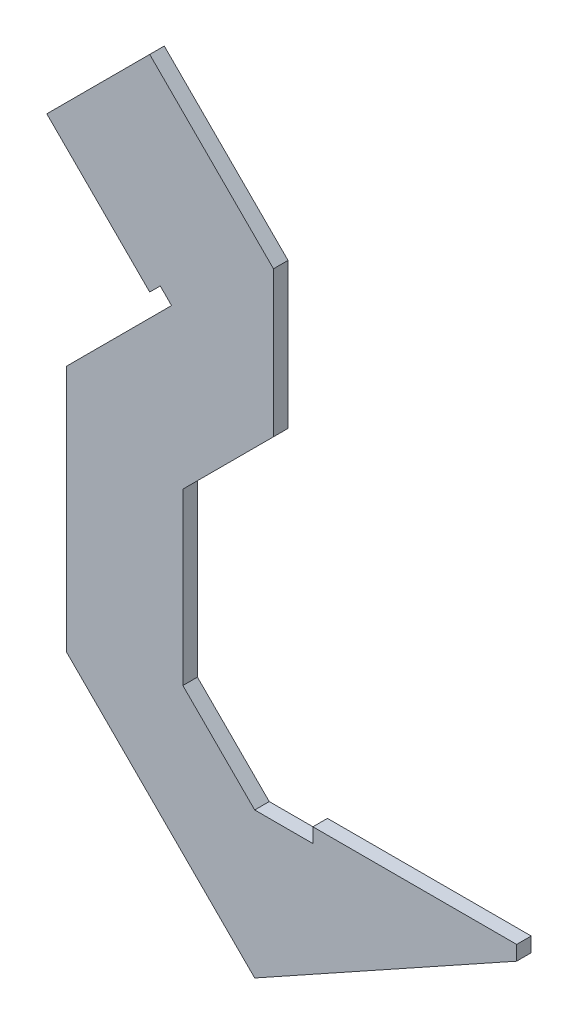
ISO-10303-21;
HEADER;
FILE_DESCRIPTION(('STEP AP214'),'2;1');
FILE_NAME('part.step','',(''),(''),'','','');
FILE_SCHEMA(('AUTOMOTIVE_DESIGN { 1 0 10303 214 1 1 1 1 }'));
ENDSEC;
DATA;
#1=APPLICATION_CONTEXT('core data for automotive mechanical design processes');
#2=APPLICATION_PROTOCOL_DEFINITION('international standard','automotive_design',2000,#1);
#3=PRODUCT_CONTEXT('',#1,'mechanical');
#4=PRODUCT('Part','Part','',(#3));
#5=PRODUCT_RELATED_PRODUCT_CATEGORY('part','',(#4));
#6=PRODUCT_DEFINITION_FORMATION('','',#4);
#7=PRODUCT_DEFINITION_CONTEXT('part definition',#1,'design');
#8=PRODUCT_DEFINITION('design','',#6,#7);
#9=PRODUCT_DEFINITION_SHAPE('','',#8);
#10=(LENGTH_UNIT() NAMED_UNIT(*) SI_UNIT(.MILLI.,.METRE.));
#11=(NAMED_UNIT(*) PLANE_ANGLE_UNIT() SI_UNIT($,.RADIAN.));
#12=(NAMED_UNIT(*) SI_UNIT($,.STERADIAN.) SOLID_ANGLE_UNIT());
#13=UNCERTAINTY_MEASURE_WITH_UNIT(LENGTH_MEASURE(1.E-05),#10,'distance_accuracy_value','');
#14=(GEOMETRIC_REPRESENTATION_CONTEXT(3) GLOBAL_UNCERTAINTY_ASSIGNED_CONTEXT((#13)) GLOBAL_UNIT_ASSIGNED_CONTEXT((#10,
#11,#12)) REPRESENTATION_CONTEXT('',''));
#15=CARTESIAN_POINT('',(0.,0.,0.));
#16=DIRECTION('',(0.,0.,1.));
#17=DIRECTION('',(1.,0.,0.));
#18=AXIS2_PLACEMENT_3D('',#15,#16,#17);
#19=CARTESIAN_POINT('',(-3.09372562444041,1.89384139237618,0.05));
#20=DIRECTION('',(1.,0.,0.));
#21=DIRECTION('',(0.,0.,-1.));
#22=AXIS2_PLACEMENT_3D('',#19,#20,#21);
#23=PLANE('',#22);
#24=DIRECTION('',(0.,-1.,0.));
#25=VECTOR('',#24,1.);
#26=CARTESIAN_POINT('',(-3.09372562444041,1.89384139237618,-0.05));
#27=LINE('',#26,#25);
#28=CARTESIAN_POINT('',(-3.09372562444041,1.89384139237618,-0.05));
#29=VERTEX_POINT('',#28);
#30=CARTESIAN_POINT('',(-3.09372562444041,0.193725624440412,-0.05));
#31=VERTEX_POINT('',#30);
#32=EDGE_CURVE('E194',#29,#31,#27,.T.);
#33=ORIENTED_EDGE('',*,*,#32,.T.);
#34=DIRECTION('',(0.,0.,-1.));
#35=VECTOR('',#34,1.);
#36=CARTESIAN_POINT('',(-3.09372562444041,0.193725624440412,0.05));
#37=LINE('',#36,#35);
#38=CARTESIAN_POINT('',(-3.09372562444041,0.193725624440412,0.05));
#39=VERTEX_POINT('',#38);
#40=EDGE_CURVE('E11',#39,#31,#37,.T.);
#41=ORIENTED_EDGE('',*,*,#40,.F.);
#42=DIRECTION('',(0.,-1.,0.));
#43=VECTOR('',#42,1.);
#44=CARTESIAN_POINT('',(-3.09372562444041,1.89384139237618,0.05));
#45=LINE('',#44,#43);
#46=CARTESIAN_POINT('',(-3.09372562444041,1.89384139237618,0.05));
#47=VERTEX_POINT('',#46);
#48=EDGE_CURVE('E243',#47,#39,#45,.T.);
#49=ORIENTED_EDGE('',*,*,#48,.F.);
#50=DIRECTION('',(0.,0.,-1.));
#51=VECTOR('',#50,1.);
#52=CARTESIAN_POINT('',(-3.09372562444041,1.89384139237618,0.05));
#53=LINE('',#52,#51);
#54=EDGE_CURVE('E190',#47,#29,#53,.T.);
#55=ORIENTED_EDGE('',*,*,#54,.T.);
#56=EDGE_LOOP('',(#33,#41,#49,#55));
#57=FACE_BOUND('',#56,.T.);
#58=ADVANCED_FACE('F39',(#57),#23,.F.);
#59=CARTESIAN_POINT('',(-3.09372562444041,0.193725624440412,0.05));
#60=DIRECTION('',(0.707106781186547,0.707106781186548,0.));
#61=DIRECTION('',(-0.707106781186548,0.707106781186547,0.));
#62=AXIS2_PLACEMENT_3D('',#59,#60,#61);
#63=PLANE('',#62);
#64=DIRECTION('',(0.707106781186548,-0.707106781186547,0.));
#65=VECTOR('',#64,1.);
#66=CARTESIAN_POINT('',(-3.09372562444041,0.193725624440412,-0.05));
#67=LINE('',#66,#65);
#68=CARTESIAN_POINT('',(-1.8,-1.1,-0.05));
#69=VERTEX_POINT('',#68);
#70=EDGE_CURVE('E198',#31,#69,#67,.T.);
#71=ORIENTED_EDGE('',*,*,#70,.T.);
#72=DIRECTION('',(0.,0.,-1.));
#73=VECTOR('',#72,1.);
#74=CARTESIAN_POINT('',(-1.8,-1.1,0.05));
#75=LINE('',#74,#73);
#76=CARTESIAN_POINT('',(-1.8,-1.1,0.05));
#77=VERTEX_POINT('',#76);
#78=EDGE_CURVE('E48',#77,#69,#75,.T.);
#79=ORIENTED_EDGE('',*,*,#78,.F.);
#80=DIRECTION('',(0.707106781186548,-0.707106781186547,0.));
#81=VECTOR('',#80,1.);
#82=CARTESIAN_POINT('',(-3.09372562444041,0.193725624440412,0.05));
#83=LINE('',#82,#81);
#84=EDGE_CURVE('E126',#39,#77,#83,.T.);
#85=ORIENTED_EDGE('',*,*,#84,.F.);
#86=ORIENTED_EDGE('',*,*,#40,.T.);
#87=EDGE_LOOP('',(#71,#79,#85,#86));
#88=FACE_BOUND('',#87,.T.);
#89=ADVANCED_FACE('F372',(#88),#63,.F.);
#90=CARTESIAN_POINT('',(-1.8,-1.1,0.05));
#91=DIRECTION('',(-0.485642931178632,0.874157276121538,0.));
#92=DIRECTION('',(-0.874157276121538,-0.485642931178632,0.));
#93=AXIS2_PLACEMENT_3D('',#90,#91,#92);
#94=PLANE('',#93);
#95=DIRECTION('',(0.874157276121538,0.485642931178632,0.));
#96=VECTOR('',#95,1.);
#97=CARTESIAN_POINT('',(-1.8,-1.1,-0.05));
#98=LINE('',#97,#96);
#99=CARTESIAN_POINT('',(0.,-0.1,-0.05));
#100=VERTEX_POINT('',#99);
#101=EDGE_CURVE('E201',#69,#100,#98,.T.);
#102=ORIENTED_EDGE('',*,*,#101,.T.);
#103=DIRECTION('',(0.,0.,-1.));
#104=VECTOR('',#103,1.);
#105=CARTESIAN_POINT('',(0.,-0.1,0.05));
#106=LINE('',#105,#104);
#107=CARTESIAN_POINT('',(0.,-0.1,0.05));
#108=VERTEX_POINT('',#107);
#109=EDGE_CURVE('E290',#108,#100,#106,.T.);
#110=ORIENTED_EDGE('',*,*,#109,.F.);
#111=DIRECTION('',(0.874157276121538,0.485642931178632,0.));
#112=VECTOR('',#111,1.);
#113=CARTESIAN_POINT('',(-1.8,-1.1,0.05));
#114=LINE('',#113,#112);
#115=EDGE_CURVE('E300',#77,#108,#114,.T.);
#116=ORIENTED_EDGE('',*,*,#115,.F.);
#117=ORIENTED_EDGE('',*,*,#78,.T.);
#118=EDGE_LOOP('',(#102,#110,#116,#117));
#119=FACE_BOUND('',#118,.T.);
#120=ADVANCED_FACE('F298',(#119),#94,.F.);
#121=CARTESIAN_POINT('',(0.,-0.1,0.05));
#122=DIRECTION('',(-1.,0.,0.));
#123=DIRECTION('',(0.,0.,1.));
#124=AXIS2_PLACEMENT_3D('',#121,#122,#123);
#125=PLANE('',#124);
#126=DIRECTION('',(0.,1.,0.));
#127=VECTOR('',#126,1.);
#128=CARTESIAN_POINT('',(0.,-0.1,-0.05));
#129=LINE('',#128,#127);
#130=CARTESIAN_POINT('',(0.,0.,-0.05));
#131=VERTEX_POINT('',#130);
#132=EDGE_CURVE('E204',#100,#131,#129,.T.);
#133=ORIENTED_EDGE('',*,*,#132,.T.);
#134=DIRECTION('',(0.,0.,-1.));
#135=VECTOR('',#134,1.);
#136=CARTESIAN_POINT('',(0.,0.,0.05));
#137=LINE('',#136,#135);
#138=CARTESIAN_POINT('',(0.,0.,0.05));
#139=VERTEX_POINT('',#138);
#140=EDGE_CURVE('E286',#139,#131,#137,.T.);
#141=ORIENTED_EDGE('',*,*,#140,.F.);
#142=DIRECTION('',(0.,1.,0.));
#143=VECTOR('',#142,1.);
#144=CARTESIAN_POINT('',(0.,-0.1,0.05));
#145=LINE('',#144,#143);
#146=EDGE_CURVE('E319',#108,#139,#145,.T.);
#147=ORIENTED_EDGE('',*,*,#146,.F.);
#148=ORIENTED_EDGE('',*,*,#109,.T.);
#149=EDGE_LOOP('',(#133,#141,#147,#148));
#150=FACE_BOUND('',#149,.T.);
#151=ADVANCED_FACE('F309',(#150),#125,.F.);
#152=CARTESIAN_POINT('',(0.,0.,0.05));
#153=DIRECTION('',(0.,-1.,0.));
#154=DIRECTION('',(1.,0.,0.));
#155=AXIS2_PLACEMENT_3D('',#152,#153,#154);
#156=PLANE('',#155);
#157=DIRECTION('',(-1.,0.,0.));
#158=VECTOR('',#157,1.);
#159=CARTESIAN_POINT('',(0.,0.,-0.05));
#160=LINE('',#159,#158);
#161=CARTESIAN_POINT('',(-1.4,0.,-0.05));
#162=VERTEX_POINT('',#161);
#163=EDGE_CURVE('E207',#131,#162,#160,.T.);
#164=ORIENTED_EDGE('',*,*,#163,.T.);
#165=DIRECTION('',(0.,0.,-1.));
#166=VECTOR('',#165,1.);
#167=CARTESIAN_POINT('',(-1.4,0.,0.05));
#168=LINE('',#167,#166);
#169=CARTESIAN_POINT('',(-1.4,0.,0.05));
#170=VERTEX_POINT('',#169);
#171=EDGE_CURVE('E282',#170,#162,#168,.T.);
#172=ORIENTED_EDGE('',*,*,#171,.F.);
#173=DIRECTION('',(-1.,0.,0.));
#174=VECTOR('',#173,1.);
#175=CARTESIAN_POINT('',(0.,0.,0.05));
#176=LINE('',#175,#174);
#177=EDGE_CURVE('E315',#139,#170,#176,.T.);
#178=ORIENTED_EDGE('',*,*,#177,.F.);
#179=ORIENTED_EDGE('',*,*,#140,.T.);
#180=EDGE_LOOP('',(#164,#172,#178,#179));
#181=FACE_BOUND('',#180,.T.);
#182=ADVANCED_FACE('F313',(#181),#156,.F.);
#183=CARTESIAN_POINT('',(-1.4,0.,0.05));
#184=DIRECTION('',(1.,0.,0.));
#185=DIRECTION('',(0.,0.,-1.));
#186=AXIS2_PLACEMENT_3D('',#183,#184,#185);
#187=PLANE('',#186);
#188=DIRECTION('',(0.,-1.,0.));
#189=VECTOR('',#188,1.);
#190=CARTESIAN_POINT('',(-1.4,0.,-0.05));
#191=LINE('',#190,#189);
#192=CARTESIAN_POINT('',(-1.4,-0.1,-0.05));
#193=VERTEX_POINT('',#192);
#194=EDGE_CURVE('E210',#162,#193,#191,.T.);
#195=ORIENTED_EDGE('',*,*,#194,.T.);
#196=DIRECTION('',(0.,0.,-1.));
#197=VECTOR('',#196,1.);
#198=CARTESIAN_POINT('',(-1.4,-0.1,0.05));
#199=LINE('',#198,#197);
#200=CARTESIAN_POINT('',(-1.4,-0.1,0.05));
#201=VERTEX_POINT('',#200);
#202=EDGE_CURVE('E278',#201,#193,#199,.T.);
#203=ORIENTED_EDGE('',*,*,#202,.F.);
#204=DIRECTION('',(0.,-1.,0.));
#205=VECTOR('',#204,1.);
#206=CARTESIAN_POINT('',(-1.4,0.,0.05));
#207=LINE('',#206,#205);
#208=EDGE_CURVE('E318',#170,#201,#207,.T.);
#209=ORIENTED_EDGE('',*,*,#208,.F.);
#210=ORIENTED_EDGE('',*,*,#171,.T.);
#211=EDGE_LOOP('',(#195,#203,#209,#210));
#212=FACE_BOUND('',#211,.T.);
#213=ADVANCED_FACE('F385',(#212),#187,.F.);
#214=CARTESIAN_POINT('',(-1.4,-0.1,0.05));
#215=DIRECTION('',(0.,-1.,0.));
#216=DIRECTION('',(1.,0.,0.));
#217=AXIS2_PLACEMENT_3D('',#214,#215,#216);
#218=PLANE('',#217);
#219=DIRECTION('',(-1.,0.,0.));
#220=VECTOR('',#219,1.);
#221=CARTESIAN_POINT('',(-1.4,-0.1,-0.05));
#222=LINE('',#221,#220);
#223=CARTESIAN_POINT('',(-1.8,-0.1,-0.05));
#224=VERTEX_POINT('',#223);
#225=EDGE_CURVE('E213',#193,#224,#222,.T.);
#226=ORIENTED_EDGE('',*,*,#225,.T.);
#227=DIRECTION('',(0.,0.,-1.));
#228=VECTOR('',#227,1.);
#229=CARTESIAN_POINT('',(-1.8,-0.1,0.05));
#230=LINE('',#229,#228);
#231=CARTESIAN_POINT('',(-1.8,-0.1,0.05));
#232=VERTEX_POINT('',#231);
#233=EDGE_CURVE('E274',#232,#224,#230,.T.);
#234=ORIENTED_EDGE('',*,*,#233,.F.);
#235=DIRECTION('',(-1.,0.,0.));
#236=VECTOR('',#235,1.);
#237=CARTESIAN_POINT('',(-1.4,-0.1,0.05));
#238=LINE('',#237,#236);
#239=EDGE_CURVE('E323',#201,#232,#238,.T.);
#240=ORIENTED_EDGE('',*,*,#239,.F.);
#241=ORIENTED_EDGE('',*,*,#202,.T.);
#242=EDGE_LOOP('',(#226,#234,#240,#241));
#243=FACE_BOUND('',#242,.T.);
#244=ADVANCED_FACE('F388',(#243),#218,.F.);
#245=CARTESIAN_POINT('',(-1.8,-0.1,0.05));
#246=DIRECTION('',(-0.707106781186548,-0.707106781186548,0.));
#247=DIRECTION('',(0.707106781186548,-0.707106781186548,0.));
#248=AXIS2_PLACEMENT_3D('',#245,#246,#247);
#249=PLANE('',#248);
#250=DIRECTION('',(-0.707106781186547,0.707106781186547,0.));
#251=VECTOR('',#250,1.);
#252=CARTESIAN_POINT('',(-1.8,-0.1,-0.05));
#253=LINE('',#252,#251);
#254=CARTESIAN_POINT('',(-2.29372562444041,0.393725624440413,-0.05));
#255=VERTEX_POINT('',#254);
#256=EDGE_CURVE('E216',#224,#255,#253,.T.);
#257=ORIENTED_EDGE('',*,*,#256,.T.);
#258=DIRECTION('',(0.,0.,-1.));
#259=VECTOR('',#258,1.);
#260=CARTESIAN_POINT('',(-2.29372562444041,0.393725624440413,0.05));
#261=LINE('',#260,#259);
#262=CARTESIAN_POINT('',(-2.29372562444041,0.393725624440413,0.05));
#263=VERTEX_POINT('',#262);
#264=EDGE_CURVE('E270',#263,#255,#261,.T.);
#265=ORIENTED_EDGE('',*,*,#264,.F.);
#266=DIRECTION('',(-0.707106781186547,0.707106781186547,0.));
#267=VECTOR('',#266,1.);
#268=CARTESIAN_POINT('',(-1.8,-0.1,0.05));
#269=LINE('',#268,#267);
#270=EDGE_CURVE('E330',#232,#263,#269,.T.);
#271=ORIENTED_EDGE('',*,*,#270,.F.);
#272=ORIENTED_EDGE('',*,*,#233,.T.);
#273=EDGE_LOOP('',(#257,#265,#271,#272));
#274=FACE_BOUND('',#273,.T.);
#275=ADVANCED_FACE('F392',(#274),#249,.F.);
#276=CARTESIAN_POINT('',(-2.29372562444041,0.393725624440413,0.05));
#277=DIRECTION('',(-1.,0.,0.));
#278=DIRECTION('',(0.,0.,1.));
#279=AXIS2_PLACEMENT_3D('',#276,#277,#278);
#280=PLANE('',#279);
#281=DIRECTION('',(0.,1.,0.));
#282=VECTOR('',#281,1.);
#283=CARTESIAN_POINT('',(-2.29372562444041,0.393725624440413,-0.05));
#284=LINE('',#283,#282);
#285=CARTESIAN_POINT('',(-2.29372562444041,1.5624705424777,-0.05));
#286=VERTEX_POINT('',#285);
#287=EDGE_CURVE('E219',#255,#286,#284,.T.);
#288=ORIENTED_EDGE('',*,*,#287,.T.);
#289=DIRECTION('',(0.,0.,-1.));
#290=VECTOR('',#289,1.);
#291=CARTESIAN_POINT('',(-2.29372562444041,1.5624705424777,0.05));
#292=LINE('',#291,#290);
#293=CARTESIAN_POINT('',(-2.29372562444041,1.5624705424777,0.05));
#294=VERTEX_POINT('',#293);
#295=EDGE_CURVE('E266',#294,#286,#292,.T.);
#296=ORIENTED_EDGE('',*,*,#295,.F.);
#297=DIRECTION('',(0.,1.,0.));
#298=VECTOR('',#297,1.);
#299=CARTESIAN_POINT('',(-2.29372562444041,0.393725624440413,0.05));
#300=LINE('',#299,#298);
#301=EDGE_CURVE('E333',#263,#294,#300,.T.);
#302=ORIENTED_EDGE('',*,*,#301,.F.);
#303=ORIENTED_EDGE('',*,*,#264,.T.);
#304=EDGE_LOOP('',(#288,#296,#302,#303));
#305=FACE_BOUND('',#304,.T.);
#306=ADVANCED_FACE('F396',(#305),#280,.F.);
#307=CARTESIAN_POINT('',(-2.29372562444041,1.5624705424777,0.05));
#308=DIRECTION('',(-0.707106781186546,0.707106781186548,0.));
#309=DIRECTION('',(-0.707106781186549,-0.707106781186547,0.));
#310=AXIS2_PLACEMENT_3D('',#307,#308,#309);
#311=PLANE('',#310);
#312=DIRECTION('',(0.707106781186548,0.707106781186546,0.));
#313=VECTOR('',#312,1.);
#314=CARTESIAN_POINT('',(-2.29372562444041,1.5624705424777,-0.05));
#315=LINE('',#314,#313);
#316=CARTESIAN_POINT('',(-1.6709913022725,2.18520486464561,-0.05));
#317=VERTEX_POINT('',#316);
#318=EDGE_CURVE('E222',#286,#317,#315,.T.);
#319=ORIENTED_EDGE('',*,*,#318,.T.);
#320=DIRECTION('',(0.,0.,-1.));
#321=VECTOR('',#320,1.);
#322=CARTESIAN_POINT('',(-1.6709913022725,2.18520486464561,0.05));
#323=LINE('',#322,#321);
#324=CARTESIAN_POINT('',(-1.6709913022725,2.18520486464561,0.05));
#325=VERTEX_POINT('',#324);
#326=EDGE_CURVE('E262',#325,#317,#323,.T.);
#327=ORIENTED_EDGE('',*,*,#326,.F.);
#328=DIRECTION('',(0.707106781186548,0.707106781186546,0.));
#329=VECTOR('',#328,1.);
#330=CARTESIAN_POINT('',(-2.29372562444041,1.5624705424777,0.05));
#331=LINE('',#330,#329);
#332=EDGE_CURVE('E336',#294,#325,#331,.T.);
#333=ORIENTED_EDGE('',*,*,#332,.F.);
#334=ORIENTED_EDGE('',*,*,#295,.T.);
#335=EDGE_LOOP('',(#319,#327,#333,#334));
#336=FACE_BOUND('',#335,.T.);
#337=ADVANCED_FACE('F400',(#336),#311,.F.);
#338=CARTESIAN_POINT('',(-1.6709913022725,2.18520486464561,0.05));
#339=DIRECTION('',(-1.,0.,0.));
#340=DIRECTION('',(0.,-1.,0.));
#341=AXIS2_PLACEMENT_3D('',#338,#339,#340);
#342=PLANE('',#341);
#343=DIRECTION('',(0.,1.,0.));
#344=VECTOR('',#343,1.);
#345=CARTESIAN_POINT('',(-1.6709913022725,2.18520486464561,-0.05));
#346=LINE('',#345,#344);
#347=CARTESIAN_POINT('',(-1.6709913022725,3.18520486464561,-0.05));
#348=VERTEX_POINT('',#347);
#349=EDGE_CURVE('E225',#317,#348,#346,.T.);
#350=ORIENTED_EDGE('',*,*,#349,.T.);
#351=DIRECTION('',(0.,0.,-1.));
#352=VECTOR('',#351,1.);
#353=CARTESIAN_POINT('',(-1.6709913022725,3.18520486464561,0.05));
#354=LINE('',#353,#352);
#355=CARTESIAN_POINT('',(-1.6709913022725,3.18520486464561,0.05));
#356=VERTEX_POINT('',#355);
#357=EDGE_CURVE('E258',#356,#348,#354,.T.);
#358=ORIENTED_EDGE('',*,*,#357,.F.);
#359=DIRECTION('',(0.,1.,0.));
#360=VECTOR('',#359,1.);
#361=CARTESIAN_POINT('',(-1.6709913022725,2.18520486464561,0.05));
#362=LINE('',#361,#360);
#363=EDGE_CURVE('E339',#325,#356,#362,.T.);
#364=ORIENTED_EDGE('',*,*,#363,.F.);
#365=ORIENTED_EDGE('',*,*,#326,.T.);
#366=EDGE_LOOP('',(#350,#358,#364,#365));
#367=FACE_BOUND('',#366,.T.);
#368=ADVANCED_FACE('F404',(#367),#342,.F.);
#369=CARTESIAN_POINT('',(-1.6709913022725,3.18520486464561,0.05));
#370=DIRECTION('',(-0.70710678118655,-0.707106781186545,0.));
#371=DIRECTION('',(0.707106781186545,-0.70710678118655,0.));
#372=AXIS2_PLACEMENT_3D('',#369,#370,#371);
#373=PLANE('',#372);
#374=DIRECTION('',(-0.707106781186545,0.70710678118655,0.));
#375=VECTOR('',#374,1.);
#376=CARTESIAN_POINT('',(-1.6709913022725,3.18520486464561,-0.05));
#377=LINE('',#376,#375);
#378=CARTESIAN_POINT('',(-2.52154208553344,4.03575564790655,-0.05));
#379=VERTEX_POINT('',#378);
#380=EDGE_CURVE('E228',#348,#379,#377,.T.);
#381=ORIENTED_EDGE('',*,*,#380,.T.);
#382=DIRECTION('',(0.,0.,-1.));
#383=VECTOR('',#382,1.);
#384=CARTESIAN_POINT('',(-2.52154208553344,4.03575564790655,0.05));
#385=LINE('',#384,#383);
#386=CARTESIAN_POINT('',(-2.52154208553344,4.03575564790655,0.05));
#387=VERTEX_POINT('',#386);
#388=EDGE_CURVE('E254',#387,#379,#385,.T.);
#389=ORIENTED_EDGE('',*,*,#388,.F.);
#390=DIRECTION('',(-0.707106781186545,0.70710678118655,0.));
#391=VECTOR('',#390,1.);
#392=CARTESIAN_POINT('',(-1.6709913022725,3.18520486464561,0.05));
#393=LINE('',#392,#391);
#394=EDGE_CURVE('E342',#356,#387,#393,.T.);
#395=ORIENTED_EDGE('',*,*,#394,.F.);
#396=ORIENTED_EDGE('',*,*,#357,.T.);
#397=EDGE_LOOP('',(#381,#389,#395,#396));
#398=FACE_BOUND('',#397,.T.);
#399=ADVANCED_FACE('F408',(#398),#373,.F.);
#400=CARTESIAN_POINT('',(-2.52154208553344,4.03575564790655,0.05));
#401=DIRECTION('',(0.707106781186548,-0.707106781186547,0.));
#402=DIRECTION('',(0.707106781186547,0.707106781186548,0.));
#403=AXIS2_PLACEMENT_3D('',#400,#401,#402);
#404=PLANE('',#403);
#405=DIRECTION('',(-0.707106781186547,-0.707106781186548,0.));
#406=VECTOR('',#405,1.);
#407=CARTESIAN_POINT('',(-2.52154208553344,4.03575564790655,-0.05));
#408=LINE('',#407,#406);
#409=CARTESIAN_POINT('',(-3.22864886671999,3.32864886672,-0.05));
#410=VERTEX_POINT('',#409);
#411=EDGE_CURVE('E231',#379,#410,#408,.T.);
#412=ORIENTED_EDGE('',*,*,#411,.T.);
#413=DIRECTION('',(0.,0.,-1.));
#414=VECTOR('',#413,1.);
#415=CARTESIAN_POINT('',(-3.22864886671999,3.32864886672,0.05));
#416=LINE('',#415,#414);
#417=CARTESIAN_POINT('',(-3.22864886671999,3.32864886672,0.05));
#418=VERTEX_POINT('',#417);
#419=EDGE_CURVE('E250',#418,#410,#416,.T.);
#420=ORIENTED_EDGE('',*,*,#419,.F.);
#421=DIRECTION('',(-0.707106781186547,-0.707106781186548,0.));
#422=VECTOR('',#421,1.);
#423=CARTESIAN_POINT('',(-2.52154208553344,4.03575564790655,0.05));
#424=LINE('',#423,#422);
#425=EDGE_CURVE('E345',#387,#418,#424,.T.);
#426=ORIENTED_EDGE('',*,*,#425,.F.);
#427=ORIENTED_EDGE('',*,*,#388,.T.);
#428=EDGE_LOOP('',(#412,#420,#426,#427));
#429=FACE_BOUND('',#428,.T.);
#430=ADVANCED_FACE('F353',(#429),#404,.F.);
#431=CARTESIAN_POINT('',(-3.22864886671999,3.32864886672,0.05));
#432=DIRECTION('',(0.707106781186548,0.707106781186547,0.));
#433=DIRECTION('',(-0.707106781186547,0.707106781186548,0.));
#434=AXIS2_PLACEMENT_3D('',#431,#432,#433);
#435=PLANE('',#434);
#436=DIRECTION('',(0.707106781186547,-0.707106781186548,0.));
#437=VECTOR('',#436,1.);
#438=CARTESIAN_POINT('',(-3.22864886671999,3.32864886672,-0.05));
#439=LINE('',#438,#437);
#440=CARTESIAN_POINT('',(-2.52154208553344,2.62154208553345,-0.05));
#441=VERTEX_POINT('',#440);
#442=EDGE_CURVE('E234',#410,#441,#439,.T.);
#443=ORIENTED_EDGE('',*,*,#442,.T.);
#444=DIRECTION('',(0.,0.,-1.));
#445=VECTOR('',#444,1.);
#446=CARTESIAN_POINT('',(-2.52154208553344,2.62154208553345,0.05));
#447=LINE('',#446,#445);
#448=CARTESIAN_POINT('',(-2.52154208553344,2.62154208553345,0.05));
#449=VERTEX_POINT('',#448);
#450=EDGE_CURVE('E183',#449,#441,#447,.T.);
#451=ORIENTED_EDGE('',*,*,#450,.F.);
#452=DIRECTION('',(0.707106781186547,-0.707106781186548,0.));
#453=VECTOR('',#452,1.);
#454=CARTESIAN_POINT('',(-3.22864886671999,3.32864886672,0.05));
#455=LINE('',#454,#453);
#456=EDGE_CURVE('E172',#418,#449,#455,.T.);
#457=ORIENTED_EDGE('',*,*,#456,.F.);
#458=ORIENTED_EDGE('',*,*,#419,.T.);
#459=EDGE_LOOP('',(#443,#451,#457,#458));
#460=FACE_BOUND('',#459,.T.);
#461=ADVANCED_FACE('F357',(#460),#435,.F.);
#462=CARTESIAN_POINT('',(-2.52154208553344,2.62154208553345,0.05));
#463=DIRECTION('',(-0.707106781186548,0.707106781186548,0.));
#464=DIRECTION('',(-0.707106781186548,-0.707106781186548,0.));
#465=AXIS2_PLACEMENT_3D('',#462,#463,#464);
#466=PLANE('',#465);
#467=DIRECTION('',(0.707106781186548,0.707106781186548,0.));
#468=VECTOR('',#467,1.);
#469=CARTESIAN_POINT('',(-2.52154208553344,2.62154208553345,-0.05));
#470=LINE('',#469,#468);
#471=CARTESIAN_POINT('',(-2.44903816671459,2.6940460043523,-0.05));
#472=VERTEX_POINT('',#471);
#473=EDGE_CURVE('E181',#441,#472,#470,.T.);
#474=ORIENTED_EDGE('',*,*,#473,.T.);
#475=DIRECTION('',(0.,0.,-1.));
#476=VECTOR('',#475,1.);
#477=CARTESIAN_POINT('',(-2.44903816671459,2.6940460043523,0.05));
#478=LINE('',#477,#476);
#479=CARTESIAN_POINT('',(-2.44903816671459,2.6940460043523,0.05));
#480=VERTEX_POINT('',#479);
#481=EDGE_CURVE('E178',#480,#472,#478,.T.);
#482=ORIENTED_EDGE('',*,*,#481,.F.);
#483=DIRECTION('',(0.707106781186548,0.707106781186548,0.));
#484=VECTOR('',#483,1.);
#485=CARTESIAN_POINT('',(-2.52154208553344,2.62154208553345,0.05));
#486=LINE('',#485,#484);
#487=EDGE_CURVE('E166',#449,#480,#486,.T.);
#488=ORIENTED_EDGE('',*,*,#487,.F.);
#489=ORIENTED_EDGE('',*,*,#450,.T.);
#490=EDGE_LOOP('',(#474,#482,#488,#489));
#491=FACE_BOUND('',#490,.T.);
#492=ADVANCED_FACE('F179',(#491),#466,.F.);
#493=CARTESIAN_POINT('',(-2.44903816671459,2.6940460043523,0.05));
#494=DIRECTION('',(0.707106781186549,0.707106781186546,0.));
#495=DIRECTION('',(-0.707106781186546,0.707106781186549,0.));
#496=AXIS2_PLACEMENT_3D('',#493,#494,#495);
#497=PLANE('',#496);
#498=DIRECTION('',(0.707106781186546,-0.707106781186549,0.));
#499=VECTOR('',#498,1.);
#500=CARTESIAN_POINT('',(-2.44903816671459,2.6940460043523,-0.05));
#501=LINE('',#500,#499);
#502=CARTESIAN_POINT('',(-2.37127958958944,2.61628742722715,-0.05));
#503=VERTEX_POINT('',#502);
#504=EDGE_CURVE('E112',#472,#503,#501,.T.);
#505=ORIENTED_EDGE('',*,*,#504,.T.);
#506=DIRECTION('',(0.,0.,-1.));
#507=VECTOR('',#506,1.);
#508=CARTESIAN_POINT('',(-2.37127958958944,2.61628742722715,0.05));
#509=LINE('',#508,#507);
#510=CARTESIAN_POINT('',(-2.37127958958944,2.61628742722715,0.05));
#511=VERTEX_POINT('',#510);
#512=EDGE_CURVE('E184',#511,#503,#509,.T.);
#513=ORIENTED_EDGE('',*,*,#512,.F.);
#514=DIRECTION('',(0.707106781186546,-0.707106781186549,0.));
#515=VECTOR('',#514,1.);
#516=CARTESIAN_POINT('',(-2.44903816671459,2.6940460043523,0.05));
#517=LINE('',#516,#515);
#518=EDGE_CURVE('E170',#480,#511,#517,.T.);
#519=ORIENTED_EDGE('',*,*,#518,.F.);
#520=ORIENTED_EDGE('',*,*,#481,.T.);
#521=EDGE_LOOP('',(#505,#513,#519,#520));
#522=FACE_BOUND('',#521,.T.);
#523=ADVANCED_FACE('F186',(#522),#497,.F.);
#524=CARTESIAN_POINT('',(-2.37127958958944,2.61628742722715,0.05));
#525=DIRECTION('',(0.707106781186548,-0.707106781186548,0.));
#526=DIRECTION('',(0.707106781186548,0.707106781186548,0.));
#527=AXIS2_PLACEMENT_3D('',#524,#525,#526);
#528=PLANE('',#527);
#529=DIRECTION('',(-0.707106781186548,-0.707106781186548,0.));
#530=VECTOR('',#529,1.);
#531=CARTESIAN_POINT('',(-2.37127958958944,2.61628742722715,-0.05));
#532=LINE('',#531,#530);
#533=EDGE_CURVE('E118',#503,#29,#532,.T.);
#534=ORIENTED_EDGE('',*,*,#533,.T.);
#535=ORIENTED_EDGE('',*,*,#54,.F.);
#536=DIRECTION('',(-0.707106781186548,-0.707106781186548,0.));
#537=VECTOR('',#536,1.);
#538=CARTESIAN_POINT('',(-2.37127958958944,2.61628742722715,0.05));
#539=LINE('',#538,#537);
#540=EDGE_CURVE('E56',#511,#47,#539,.T.);
#541=ORIENTED_EDGE('',*,*,#540,.F.);
#542=ORIENTED_EDGE('',*,*,#512,.T.);
#543=EDGE_LOOP('',(#534,#535,#541,#542));
#544=FACE_BOUND('',#543,.T.);
#545=ADVANCED_FACE('F361',(#544),#528,.F.);
#546=CARTESIAN_POINT('',(0.,0.,0.05));
#547=DIRECTION('',(0.,0.,-1.));
#548=DIRECTION('',(-1.,0.,0.));
#549=AXIS2_PLACEMENT_3D('',#546,#547,#548);
#550=PLANE('',#549);
#551=ORIENTED_EDGE('',*,*,#48,.T.);
#552=ORIENTED_EDGE('',*,*,#84,.T.);
#553=ORIENTED_EDGE('',*,*,#115,.T.);
#554=ORIENTED_EDGE('',*,*,#146,.T.);
#555=ORIENTED_EDGE('',*,*,#177,.T.);
#556=ORIENTED_EDGE('',*,*,#208,.T.);
#557=ORIENTED_EDGE('',*,*,#239,.T.);
#558=ORIENTED_EDGE('',*,*,#270,.T.);
#559=ORIENTED_EDGE('',*,*,#301,.T.);
#560=ORIENTED_EDGE('',*,*,#332,.T.);
#561=ORIENTED_EDGE('',*,*,#363,.T.);
#562=ORIENTED_EDGE('',*,*,#394,.T.);
#563=ORIENTED_EDGE('',*,*,#425,.T.);
#564=ORIENTED_EDGE('',*,*,#456,.T.);
#565=ORIENTED_EDGE('',*,*,#487,.T.);
#566=ORIENTED_EDGE('',*,*,#518,.T.);
#567=ORIENTED_EDGE('',*,*,#540,.T.);
#568=EDGE_LOOP('',(#551,#552,#553,#554,#555,#556,#557,#558,#559,#560,#561,#562,#563,#564,#565,
#566,#567));
#569=FACE_BOUND('',#568,.T.);
#570=ADVANCED_FACE('F168',(#569),#550,.F.);
#571=CARTESIAN_POINT('',(0.,0.,-0.05));
#572=DIRECTION('',(0.,0.,-1.));
#573=DIRECTION('',(-1.,0.,0.));
#574=AXIS2_PLACEMENT_3D('',#571,#572,#573);
#575=PLANE('',#574);
#576=ORIENTED_EDGE('',*,*,#32,.F.);
#577=ORIENTED_EDGE('',*,*,#533,.F.);
#578=ORIENTED_EDGE('',*,*,#504,.F.);
#579=ORIENTED_EDGE('',*,*,#473,.F.);
#580=ORIENTED_EDGE('',*,*,#442,.F.);
#581=ORIENTED_EDGE('',*,*,#411,.F.);
#582=ORIENTED_EDGE('',*,*,#380,.F.);
#583=ORIENTED_EDGE('',*,*,#349,.F.);
#584=ORIENTED_EDGE('',*,*,#318,.F.);
#585=ORIENTED_EDGE('',*,*,#287,.F.);
#586=ORIENTED_EDGE('',*,*,#256,.F.);
#587=ORIENTED_EDGE('',*,*,#225,.F.);
#588=ORIENTED_EDGE('',*,*,#194,.F.);
#589=ORIENTED_EDGE('',*,*,#163,.F.);
#590=ORIENTED_EDGE('',*,*,#132,.F.);
#591=ORIENTED_EDGE('',*,*,#101,.F.);
#592=ORIENTED_EDGE('',*,*,#70,.F.);
#593=EDGE_LOOP('',(#576,#577,#578,#579,#580,#581,#582,#583,#584,#585,#586,#587,#588,#589,#590,
#591,#592));
#594=FACE_BOUND('',#593,.T.);
#595=ADVANCED_FACE('F304',(#594),#575,.T.);
#596=CLOSED_SHELL('',(#58,#89,#120,#151,#182,#213,#244,#275,#306,#337,#368,#399,#430,#461,#492,
#523,#545,#570,#595));
#597=MANIFOLD_SOLID_BREP('B2',#596);
#598=ADVANCED_BREP_SHAPE_REPRESENTATION('',(#18,#597),#14);
#599=SHAPE_DEFINITION_REPRESENTATION(#9,#598);
ENDSEC;
END-ISO-10303-21;
